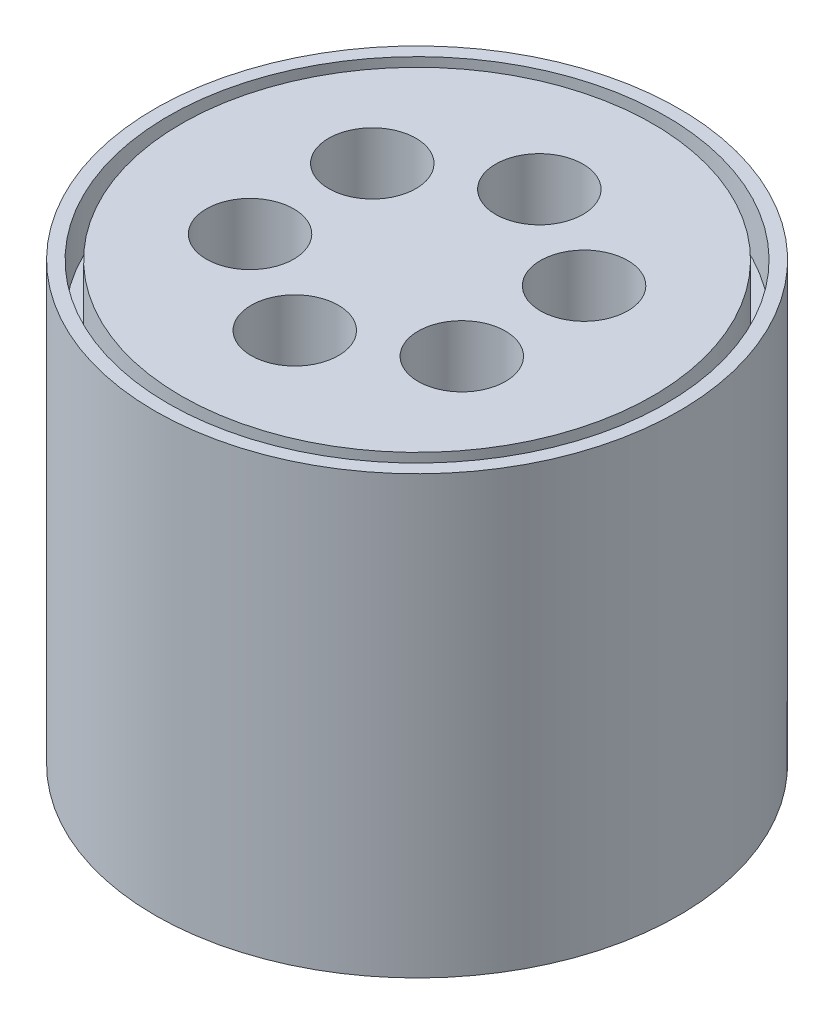
ISO-10303-21;
HEADER;
FILE_DESCRIPTION(('STEP AP214'),'2;1');
FILE_NAME('part.step','',(''),(''),'','','');
FILE_SCHEMA(('AUTOMOTIVE_DESIGN { 1 0 10303 214 1 1 1 1 }'));
ENDSEC;
DATA;
#1=APPLICATION_CONTEXT('core data for automotive mechanical design processes');
#2=APPLICATION_PROTOCOL_DEFINITION('international standard','automotive_design',2000,#1);
#3=PRODUCT_CONTEXT('',#1,'mechanical');
#4=PRODUCT('Part','Part','',(#3));
#5=PRODUCT_RELATED_PRODUCT_CATEGORY('part','',(#4));
#6=PRODUCT_DEFINITION_FORMATION('','',#4);
#7=PRODUCT_DEFINITION_CONTEXT('part definition',#1,'design');
#8=PRODUCT_DEFINITION('design','',#6,#7);
#9=PRODUCT_DEFINITION_SHAPE('','',#8);
#10=(LENGTH_UNIT() NAMED_UNIT(*) SI_UNIT(.MILLI.,.METRE.));
#11=(NAMED_UNIT(*) PLANE_ANGLE_UNIT() SI_UNIT($,.RADIAN.));
#12=(NAMED_UNIT(*) SI_UNIT($,.STERADIAN.) SOLID_ANGLE_UNIT());
#13=UNCERTAINTY_MEASURE_WITH_UNIT(LENGTH_MEASURE(1.E-05),#10,'distance_accuracy_value','');
#14=(GEOMETRIC_REPRESENTATION_CONTEXT(3) GLOBAL_UNCERTAINTY_ASSIGNED_CONTEXT((#13)) GLOBAL_UNIT_ASSIGNED_CONTEXT((#10,
#11,#12)) REPRESENTATION_CONTEXT('',''));
#15=CARTESIAN_POINT('',(0.,0.,0.));
#16=DIRECTION('',(0.,0.,1.));
#17=DIRECTION('',(1.,0.,0.));
#18=AXIS2_PLACEMENT_3D('',#15,#16,#17);
#19=CARTESIAN_POINT('',(0.,25.,0.));
#20=DIRECTION('',(0.,-1.,0.));
#21=DIRECTION('',(0.,0.,-1.));
#22=AXIS2_PLACEMENT_3D('',#19,#20,#21);
#23=CYLINDRICAL_SURFACE('',#22,15.);
#24=CARTESIAN_POINT('',(0.,25.,0.));
#25=DIRECTION('',(0.,1.,0.));
#26=DIRECTION('',(0.,0.,1.));
#27=AXIS2_PLACEMENT_3D('',#24,#25,#26);
#28=CIRCLE('',#27,15.);
#29=CARTESIAN_POINT('',(0.,25.,15.));
#30=VERTEX_POINT('',#29);
#31=EDGE_CURVE('E10',#30,#30,#28,.T.);
#32=ORIENTED_EDGE('',*,*,#31,.F.);
#33=EDGE_LOOP('',(#32));
#34=FACE_BOUND('',#33,.T.);
#35=CARTESIAN_POINT('',(0.,0.,0.));
#36=DIRECTION('',(0.,1.,0.));
#37=DIRECTION('',(0.,0.,1.));
#38=AXIS2_PLACEMENT_3D('',#35,#36,#37);
#39=CIRCLE('',#38,15.);
#40=CARTESIAN_POINT('',(0.,0.,15.));
#41=VERTEX_POINT('',#40);
#42=EDGE_CURVE('E40',#41,#41,#39,.T.);
#43=ORIENTED_EDGE('',*,*,#42,.T.);
#44=EDGE_LOOP('',(#43));
#45=FACE_BOUND('',#44,.T.);
#46=ADVANCED_FACE('F37',(#34,#45),#23,.T.);
#47=CARTESIAN_POINT('',(0.,25.,0.));
#48=DIRECTION('',(0.,1.,0.));
#49=DIRECTION('',(0.,0.,1.));
#50=AXIS2_PLACEMENT_3D('',#47,#48,#49);
#51=PLANE('',#50);
#52=CARTESIAN_POINT('',(0.,25.,0.));
#53=DIRECTION('',(0.,1.,0.));
#54=DIRECTION('',(0.,0.,1.));
#55=AXIS2_PLACEMENT_3D('',#52,#53,#54);
#56=CIRCLE('',#55,14.25);
#57=CARTESIAN_POINT('',(0.,25.,14.25));
#58=VERTEX_POINT('',#57);
#59=EDGE_CURVE('E49',#58,#58,#56,.T.);
#60=ORIENTED_EDGE('',*,*,#59,.F.);
#61=EDGE_LOOP('',(#60));
#62=FACE_BOUND('',#61,.T.);
#63=ORIENTED_EDGE('',*,*,#31,.T.);
#64=EDGE_LOOP('',(#63));
#65=FACE_BOUND('',#64,.T.);
#66=ADVANCED_FACE('F116',(#62,#65),#51,.T.);
#67=CARTESIAN_POINT('',(0.,0.,0.));
#68=DIRECTION('',(0.,1.,0.));
#69=DIRECTION('',(0.,0.,1.));
#70=AXIS2_PLACEMENT_3D('',#67,#68,#69);
#71=PLANE('',#70);
#72=CARTESIAN_POINT('',(0.,0.,0.));
#73=DIRECTION('',(0.,-1.,0.));
#74=DIRECTION('',(0.,0.,-1.));
#75=AXIS2_PLACEMENT_3D('',#72,#73,#74);
#76=CIRCLE('',#75,2.5);
#77=CARTESIAN_POINT('',(0.,0.,-2.5));
#78=VERTEX_POINT('',#77);
#79=EDGE_CURVE('E97',#78,#78,#76,.T.);
#80=ORIENTED_EDGE('',*,*,#79,.F.);
#81=EDGE_LOOP('',(#80));
#82=FACE_BOUND('',#81,.T.);
#83=ORIENTED_EDGE('',*,*,#42,.F.);
#84=EDGE_LOOP('',(#83));
#85=FACE_BOUND('',#84,.T.);
#86=ADVANCED_FACE('F112',(#82,#85),#71,.F.);
#87=CARTESIAN_POINT('',(0.,22.,0.));
#88=DIRECTION('',(0.,1.,0.));
#89=DIRECTION('',(0.,0.,1.));
#90=AXIS2_PLACEMENT_3D('',#87,#88,#89);
#91=CYLINDRICAL_SURFACE('',#90,14.25);
#92=CARTESIAN_POINT('',(0.,22.,0.));
#93=DIRECTION('',(0.,1.,0.));
#94=DIRECTION('',(0.,0.,1.));
#95=AXIS2_PLACEMENT_3D('',#92,#93,#94);
#96=CIRCLE('',#95,14.25);
#97=CARTESIAN_POINT('',(0.,22.,14.25));
#98=VERTEX_POINT('',#97);
#99=EDGE_CURVE('E47',#98,#98,#96,.T.);
#100=ORIENTED_EDGE('',*,*,#99,.F.);
#101=EDGE_LOOP('',(#100));
#102=FACE_BOUND('',#101,.T.);
#103=ORIENTED_EDGE('',*,*,#59,.T.);
#104=EDGE_LOOP('',(#103));
#105=FACE_BOUND('',#104,.T.);
#106=ADVANCED_FACE('F115',(#102,#105),#91,.F.);
#107=CARTESIAN_POINT('',(0.,22.,0.));
#108=DIRECTION('',(0.,1.,0.));
#109=DIRECTION('',(0.,0.,1.));
#110=AXIS2_PLACEMENT_3D('',#107,#108,#109);
#111=PLANE('',#110);
#112=CARTESIAN_POINT('',(0.,22.,0.));
#113=DIRECTION('',(0.,1.,0.));
#114=DIRECTION('',(0.,0.,1.));
#115=AXIS2_PLACEMENT_3D('',#112,#113,#114);
#116=CIRCLE('',#115,13.5);
#117=CARTESIAN_POINT('',(0.,22.,13.5));
#118=VERTEX_POINT('',#117);
#119=EDGE_CURVE('E52',#118,#118,#116,.T.);
#120=ORIENTED_EDGE('',*,*,#119,.F.);
#121=EDGE_LOOP('',(#120));
#122=FACE_BOUND('',#121,.T.);
#123=ORIENTED_EDGE('',*,*,#99,.T.);
#124=EDGE_LOOP('',(#123));
#125=FACE_BOUND('',#124,.T.);
#126=ADVANCED_FACE('F142',(#122,#125),#111,.T.);
#127=CARTESIAN_POINT('',(0.,22.,0.));
#128=DIRECTION('',(0.,1.,0.));
#129=DIRECTION('',(0.,0.,1.));
#130=AXIS2_PLACEMENT_3D('',#127,#128,#129);
#131=CYLINDRICAL_SURFACE('',#130,13.5);
#132=ORIENTED_EDGE('',*,*,#119,.T.);
#133=EDGE_LOOP('',(#132));
#134=FACE_BOUND('',#133,.T.);
#135=CARTESIAN_POINT('',(0.,25.,0.));
#136=DIRECTION('',(0.,1.,0.));
#137=DIRECTION('',(0.,0.,1.));
#138=AXIS2_PLACEMENT_3D('',#135,#136,#137);
#139=CIRCLE('',#138,13.5);
#140=CARTESIAN_POINT('',(0.,25.,13.5));
#141=VERTEX_POINT('',#140);
#142=EDGE_CURVE('E55',#141,#141,#139,.T.);
#143=ORIENTED_EDGE('',*,*,#142,.F.);
#144=EDGE_LOOP('',(#143));
#145=FACE_BOUND('',#144,.T.);
#146=ADVANCED_FACE('F133',(#134,#145),#131,.T.);
#147=CARTESIAN_POINT('',(6.06217782649108,25.,-3.49999999999999));
#148=DIRECTION('',(0.,1.,0.));
#149=DIRECTION('',(0.,0.,1.));
#150=AXIS2_PLACEMENT_3D('',#147,#148,#149);
#151=CIRCLE('',#150,2.5);
#152=CARTESIAN_POINT('',(6.06217782649108,25.,-0.999999999999986));
#153=VERTEX_POINT('',#152);
#154=EDGE_CURVE('E64',#153,#153,#151,.T.);
#155=ORIENTED_EDGE('',*,*,#154,.F.);
#156=EDGE_LOOP('',(#155));
#157=FACE_BOUND('',#156,.T.);
#158=CARTESIAN_POINT('',(6.06217782649106,25.,3.50000000000003));
#159=DIRECTION('',(0.,1.,0.));
#160=DIRECTION('',(0.,0.,1.));
#161=AXIS2_PLACEMENT_3D('',#158,#159,#160);
#162=CIRCLE('',#161,2.5);
#163=CARTESIAN_POINT('',(6.06217782649106,25.,6.00000000000003));
#164=VERTEX_POINT('',#163);
#165=EDGE_CURVE('E83',#164,#164,#162,.T.);
#166=ORIENTED_EDGE('',*,*,#165,.F.);
#167=EDGE_LOOP('',(#166));
#168=FACE_BOUND('',#167,.T.);
#169=CARTESIAN_POINT('',(0.,25.,7.));
#170=DIRECTION('',(0.,1.,0.));
#171=DIRECTION('',(0.,0.,1.));
#172=AXIS2_PLACEMENT_3D('',#169,#170,#171);
#173=CIRCLE('',#172,2.5);
#174=CARTESIAN_POINT('',(0.,25.,9.5));
#175=VERTEX_POINT('',#174);
#176=EDGE_CURVE('E77',#175,#175,#173,.T.);
#177=ORIENTED_EDGE('',*,*,#176,.F.);
#178=EDGE_LOOP('',(#177));
#179=FACE_BOUND('',#178,.T.);
#180=CARTESIAN_POINT('',(-6.06217782649111,25.,3.49999999999994));
#181=DIRECTION('',(0.,1.,0.));
#182=DIRECTION('',(0.,0.,1.));
#183=AXIS2_PLACEMENT_3D('',#180,#181,#182);
#184=CIRCLE('',#183,2.5);
#185=CARTESIAN_POINT('',(-6.06217782649111,25.,5.99999999999994));
#186=VERTEX_POINT('',#185);
#187=EDGE_CURVE('E70',#186,#186,#184,.T.);
#188=ORIENTED_EDGE('',*,*,#187,.F.);
#189=EDGE_LOOP('',(#188));
#190=FACE_BOUND('',#189,.T.);
#191=CARTESIAN_POINT('',(-6.06217782649103,25.,-3.50000000000007));
#192=DIRECTION('',(0.,1.,0.));
#193=DIRECTION('',(0.,0.,1.));
#194=AXIS2_PLACEMENT_3D('',#191,#192,#193);
#195=CIRCLE('',#194,2.5);
#196=CARTESIAN_POINT('',(-6.06217782649103,25.,-1.00000000000007));
#197=VERTEX_POINT('',#196);
#198=EDGE_CURVE('E71',#197,#197,#195,.T.);
#199=ORIENTED_EDGE('',*,*,#198,.F.);
#200=EDGE_LOOP('',(#199));
#201=FACE_BOUND('',#200,.T.);
#202=CARTESIAN_POINT('',(0.,25.,-7.));
#203=DIRECTION('',(0.,1.,0.));
#204=DIRECTION('',(0.,0.,1.));
#205=AXIS2_PLACEMENT_3D('',#202,#203,#204);
#206=CIRCLE('',#205,2.5);
#207=CARTESIAN_POINT('',(0.,25.,-4.5));
#208=VERTEX_POINT('',#207);
#209=EDGE_CURVE('E61',#208,#208,#206,.T.);
#210=ORIENTED_EDGE('',*,*,#209,.F.);
#211=EDGE_LOOP('',(#210));
#212=FACE_BOUND('',#211,.T.);
#213=ORIENTED_EDGE('',*,*,#142,.T.);
#214=EDGE_LOOP('',(#213));
#215=FACE_BOUND('',#214,.T.);
#216=ADVANCED_FACE('F126',(#157,#168,#179,#190,#201,#212,#215),#51,.T.);
#217=CARTESIAN_POINT('',(0.,3.,-7.));
#218=DIRECTION('',(0.,1.,0.));
#219=DIRECTION('',(0.,0.,1.));
#220=AXIS2_PLACEMENT_3D('',#217,#218,#219);
#221=CYLINDRICAL_SURFACE('',#220,2.5);
#222=CARTESIAN_POINT('',(0.,3.,-7.));
#223=DIRECTION('',(0.,1.,0.));
#224=DIRECTION('',(0.,0.,1.));
#225=AXIS2_PLACEMENT_3D('',#222,#223,#224);
#226=CIRCLE('',#225,2.5);
#227=CARTESIAN_POINT('',(0.,3.,-4.5));
#228=VERTEX_POINT('',#227);
#229=EDGE_CURVE('E58',#228,#228,#226,.T.);
#230=ORIENTED_EDGE('',*,*,#229,.F.);
#231=EDGE_LOOP('',(#230));
#232=FACE_BOUND('',#231,.T.);
#233=ORIENTED_EDGE('',*,*,#209,.T.);
#234=EDGE_LOOP('',(#233));
#235=FACE_BOUND('',#234,.T.);
#236=ADVANCED_FACE('F132',(#232,#235),#221,.F.);
#237=CARTESIAN_POINT('',(0.,3.,-7.));
#238=DIRECTION('',(0.,1.,0.));
#239=DIRECTION('',(0.,0.,1.));
#240=AXIS2_PLACEMENT_3D('',#237,#238,#239);
#241=PLANE('',#240);
#242=ORIENTED_EDGE('',*,*,#229,.T.);
#243=EDGE_LOOP('',(#242));
#244=FACE_BOUND('',#243,.T.);
#245=ADVANCED_FACE('F139',(#244),#241,.T.);
#246=CARTESIAN_POINT('',(-6.06217782649103,3.,-3.50000000000007));
#247=DIRECTION('',(0.,1.,0.));
#248=DIRECTION('',(0.,0.,1.));
#249=AXIS2_PLACEMENT_3D('',#246,#247,#248);
#250=CYLINDRICAL_SURFACE('',#249,2.5);
#251=CARTESIAN_POINT('',(-6.06217782649103,3.,-3.50000000000007));
#252=DIRECTION('',(0.,1.,0.));
#253=DIRECTION('',(0.,0.,1.));
#254=AXIS2_PLACEMENT_3D('',#251,#252,#253);
#255=CIRCLE('',#254,2.5);
#256=CARTESIAN_POINT('',(-6.06217782649103,3.,-1.00000000000007));
#257=VERTEX_POINT('',#256);
#258=EDGE_CURVE('E91',#257,#257,#255,.T.);
#259=ORIENTED_EDGE('',*,*,#258,.F.);
#260=EDGE_LOOP('',(#259));
#261=FACE_BOUND('',#260,.T.);
#262=ORIENTED_EDGE('',*,*,#198,.T.);
#263=EDGE_LOOP('',(#262));
#264=FACE_BOUND('',#263,.T.);
#265=ADVANCED_FACE('F161',(#261,#264),#250,.F.);
#266=CARTESIAN_POINT('',(-6.06217782649103,3.,-3.50000000000007));
#267=DIRECTION('',(0.,1.,0.));
#268=DIRECTION('',(0.,0.,1.));
#269=AXIS2_PLACEMENT_3D('',#266,#267,#268);
#270=PLANE('',#269);
#271=ORIENTED_EDGE('',*,*,#258,.T.);
#272=EDGE_LOOP('',(#271));
#273=FACE_BOUND('',#272,.T.);
#274=ADVANCED_FACE('F163',(#273),#270,.T.);
#275=CARTESIAN_POINT('',(-6.06217782649111,3.,3.49999999999994));
#276=DIRECTION('',(0.,1.,0.));
#277=DIRECTION('',(0.,0.,1.));
#278=AXIS2_PLACEMENT_3D('',#275,#276,#277);
#279=CYLINDRICAL_SURFACE('',#278,2.5);
#280=CARTESIAN_POINT('',(-6.06217782649111,3.,3.49999999999994));
#281=DIRECTION('',(0.,1.,0.));
#282=DIRECTION('',(0.,0.,1.));
#283=AXIS2_PLACEMENT_3D('',#280,#281,#282);
#284=CIRCLE('',#283,2.5);
#285=CARTESIAN_POINT('',(-6.06217782649111,3.,5.99999999999994));
#286=VERTEX_POINT('',#285);
#287=EDGE_CURVE('E67',#286,#286,#284,.T.);
#288=ORIENTED_EDGE('',*,*,#287,.F.);
#289=EDGE_LOOP('',(#288));
#290=FACE_BOUND('',#289,.T.);
#291=ORIENTED_EDGE('',*,*,#187,.T.);
#292=EDGE_LOOP('',(#291));
#293=FACE_BOUND('',#292,.T.);
#294=ADVANCED_FACE('F170',(#290,#293),#279,.F.);
#295=CARTESIAN_POINT('',(-6.06217782649111,3.,3.49999999999994));
#296=DIRECTION('',(0.,1.,0.));
#297=DIRECTION('',(0.,0.,1.));
#298=AXIS2_PLACEMENT_3D('',#295,#296,#297);
#299=PLANE('',#298);
#300=ORIENTED_EDGE('',*,*,#287,.T.);
#301=EDGE_LOOP('',(#300));
#302=FACE_BOUND('',#301,.T.);
#303=ADVANCED_FACE('F197',(#302),#299,.T.);
#304=CARTESIAN_POINT('',(0.,3.,7.));
#305=DIRECTION('',(0.,1.,0.));
#306=DIRECTION('',(0.,0.,1.));
#307=AXIS2_PLACEMENT_3D('',#304,#305,#306);
#308=CYLINDRICAL_SURFACE('',#307,2.5);
#309=CARTESIAN_POINT('',(0.,3.,7.));
#310=DIRECTION('',(0.,1.,0.));
#311=DIRECTION('',(0.,0.,1.));
#312=AXIS2_PLACEMENT_3D('',#309,#310,#311);
#313=CIRCLE('',#312,2.5);
#314=CARTESIAN_POINT('',(0.,3.,9.5));
#315=VERTEX_POINT('',#314);
#316=EDGE_CURVE('E74',#315,#315,#313,.T.);
#317=ORIENTED_EDGE('',*,*,#316,.F.);
#318=EDGE_LOOP('',(#317));
#319=FACE_BOUND('',#318,.T.);
#320=ORIENTED_EDGE('',*,*,#176,.T.);
#321=EDGE_LOOP('',(#320));
#322=FACE_BOUND('',#321,.T.);
#323=ADVANCED_FACE('F194',(#319,#322),#308,.F.);
#324=CARTESIAN_POINT('',(0.,3.,7.));
#325=DIRECTION('',(0.,1.,0.));
#326=DIRECTION('',(0.,0.,1.));
#327=AXIS2_PLACEMENT_3D('',#324,#325,#326);
#328=PLANE('',#327);
#329=ORIENTED_EDGE('',*,*,#316,.T.);
#330=EDGE_LOOP('',(#329));
#331=FACE_BOUND('',#330,.T.);
#332=ADVANCED_FACE('F189',(#331),#328,.T.);
#333=CARTESIAN_POINT('',(6.06217782649106,3.,3.50000000000003));
#334=DIRECTION('',(0.,1.,0.));
#335=DIRECTION('',(0.,0.,1.));
#336=AXIS2_PLACEMENT_3D('',#333,#334,#335);
#337=CYLINDRICAL_SURFACE('',#336,2.5);
#338=CARTESIAN_POINT('',(6.06217782649106,3.,3.50000000000003));
#339=DIRECTION('',(0.,1.,0.));
#340=DIRECTION('',(0.,0.,1.));
#341=AXIS2_PLACEMENT_3D('',#338,#339,#340);
#342=CIRCLE('',#341,2.5);
#343=CARTESIAN_POINT('',(6.06217782649106,3.,6.00000000000003));
#344=VERTEX_POINT('',#343);
#345=EDGE_CURVE('E80',#344,#344,#342,.T.);
#346=ORIENTED_EDGE('',*,*,#345,.F.);
#347=EDGE_LOOP('',(#346));
#348=FACE_BOUND('',#347,.T.);
#349=ORIENTED_EDGE('',*,*,#165,.T.);
#350=EDGE_LOOP('',(#349));
#351=FACE_BOUND('',#350,.T.);
#352=ADVANCED_FACE('F186',(#348,#351),#337,.F.);
#353=CARTESIAN_POINT('',(6.06217782649106,3.,3.50000000000003));
#354=DIRECTION('',(0.,1.,0.));
#355=DIRECTION('',(0.,0.,1.));
#356=AXIS2_PLACEMENT_3D('',#353,#354,#355);
#357=PLANE('',#356);
#358=ORIENTED_EDGE('',*,*,#345,.T.);
#359=EDGE_LOOP('',(#358));
#360=FACE_BOUND('',#359,.T.);
#361=ADVANCED_FACE('F181',(#360),#357,.T.);
#362=CARTESIAN_POINT('',(6.06217782649108,3.,-3.49999999999999));
#363=DIRECTION('',(0.,1.,0.));
#364=DIRECTION('',(0.,0.,1.));
#365=AXIS2_PLACEMENT_3D('',#362,#363,#364);
#366=CYLINDRICAL_SURFACE('',#365,2.5);
#367=CARTESIAN_POINT('',(6.06217782649108,3.,-3.49999999999999));
#368=DIRECTION('',(0.,1.,0.));
#369=DIRECTION('',(0.,0.,1.));
#370=AXIS2_PLACEMENT_3D('',#367,#368,#369);
#371=CIRCLE('',#370,2.5);
#372=CARTESIAN_POINT('',(6.06217782649108,3.,-0.999999999999986));
#373=VERTEX_POINT('',#372);
#374=EDGE_CURVE('E86',#373,#373,#371,.T.);
#375=ORIENTED_EDGE('',*,*,#374,.F.);
#376=EDGE_LOOP('',(#375));
#377=FACE_BOUND('',#376,.T.);
#378=ORIENTED_EDGE('',*,*,#154,.T.);
#379=EDGE_LOOP('',(#378));
#380=FACE_BOUND('',#379,.T.);
#381=ADVANCED_FACE('F178',(#377,#380),#366,.F.);
#382=CARTESIAN_POINT('',(6.06217782649108,3.,-3.49999999999999));
#383=DIRECTION('',(0.,1.,0.));
#384=DIRECTION('',(0.,0.,1.));
#385=AXIS2_PLACEMENT_3D('',#382,#383,#384);
#386=PLANE('',#385);
#387=ORIENTED_EDGE('',*,*,#374,.T.);
#388=EDGE_LOOP('',(#387));
#389=FACE_BOUND('',#388,.T.);
#390=ADVANCED_FACE('F108',(#389),#386,.T.);
#391=CARTESIAN_POINT('',(0.,10.,0.));
#392=DIRECTION('',(0.,-1.,0.));
#393=DIRECTION('',(0.,0.,-1.));
#394=AXIS2_PLACEMENT_3D('',#391,#392,#393);
#395=CYLINDRICAL_SURFACE('',#394,2.5);
#396=CARTESIAN_POINT('',(0.,10.,0.));
#397=DIRECTION('',(0.,-1.,0.));
#398=DIRECTION('',(0.,0.,-1.));
#399=AXIS2_PLACEMENT_3D('',#396,#397,#398);
#400=CIRCLE('',#399,2.5);
#401=CARTESIAN_POINT('',(0.,10.,-2.5));
#402=VERTEX_POINT('',#401);
#403=EDGE_CURVE('E94',#402,#402,#400,.T.);
#404=ORIENTED_EDGE('',*,*,#403,.F.);
#405=EDGE_LOOP('',(#404));
#406=FACE_BOUND('',#405,.T.);
#407=ORIENTED_EDGE('',*,*,#79,.T.);
#408=EDGE_LOOP('',(#407));
#409=FACE_BOUND('',#408,.T.);
#410=ADVANCED_FACE('F105',(#406,#409),#395,.F.);
#411=CARTESIAN_POINT('',(0.,10.,0.));
#412=DIRECTION('',(0.,-1.,0.));
#413=DIRECTION('',(0.,0.,-1.));
#414=AXIS2_PLACEMENT_3D('',#411,#412,#413);
#415=PLANE('',#414);
#416=ORIENTED_EDGE('',*,*,#403,.T.);
#417=EDGE_LOOP('',(#416));
#418=FACE_BOUND('',#417,.T.);
#419=ADVANCED_FACE('F103',(#418),#415,.T.);
#420=CLOSED_SHELL('',(#46,#66,#86,#106,#126,#146,#216,#236,#245,#265,#274,#294,#303,#323,#332,
#352,#361,#381,#390,#410,#419));
#421=MANIFOLD_SOLID_BREP('B2',#420);
#422=ADVANCED_BREP_SHAPE_REPRESENTATION('',(#18,#421),#14);
#423=SHAPE_DEFINITION_REPRESENTATION(#9,#422);
ENDSEC;
END-ISO-10303-21;
